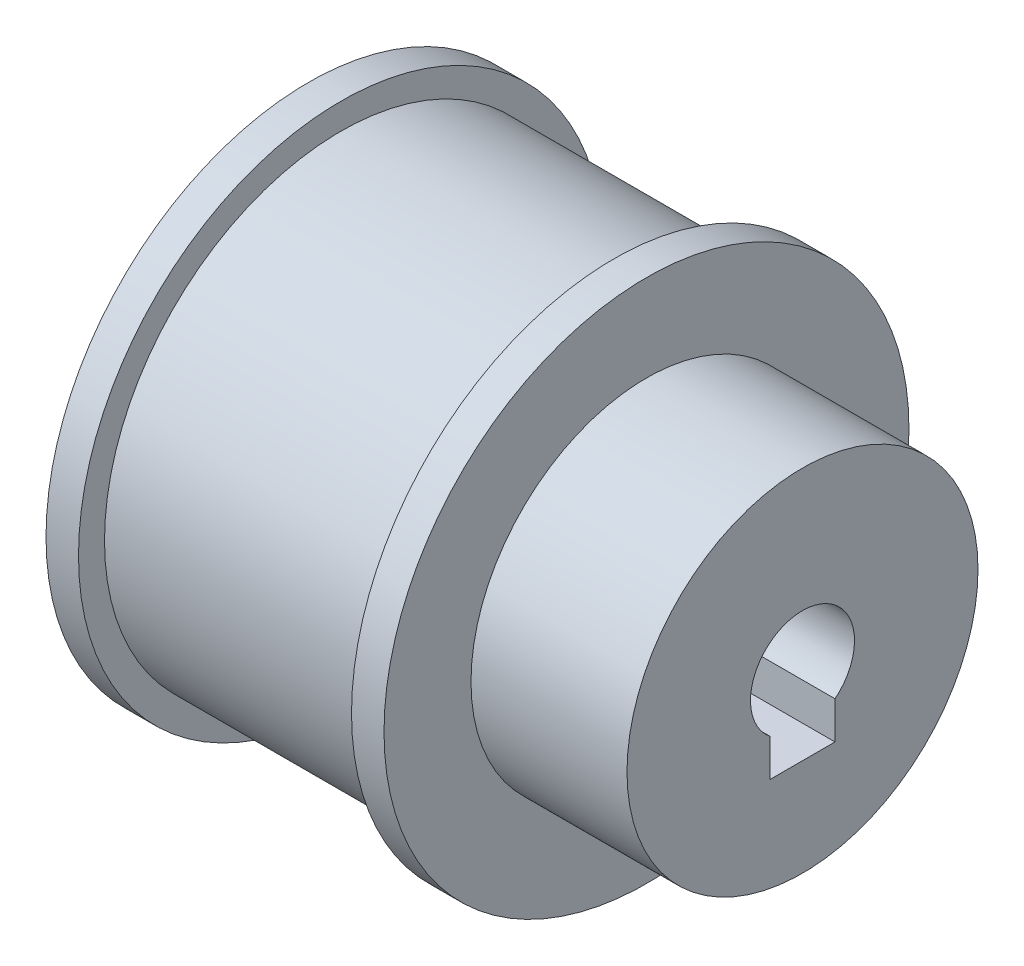
ISO-10303-21;
HEADER;
FILE_DESCRIPTION(('STEP AP214'),'2;1');
FILE_NAME('part.step','',(''),(''),'','','');
FILE_SCHEMA(('AUTOMOTIVE_DESIGN { 1 0 10303 214 1 1 1 1 }'));
ENDSEC;
DATA;
#1=APPLICATION_CONTEXT('core data for automotive mechanical design processes');
#2=APPLICATION_PROTOCOL_DEFINITION('international standard','automotive_design',2000,#1);
#3=PRODUCT_CONTEXT('',#1,'mechanical');
#4=PRODUCT('Part','Part','',(#3));
#5=PRODUCT_RELATED_PRODUCT_CATEGORY('part','',(#4));
#6=PRODUCT_DEFINITION_FORMATION('','',#4);
#7=PRODUCT_DEFINITION_CONTEXT('part definition',#1,'design');
#8=PRODUCT_DEFINITION('design','',#6,#7);
#9=PRODUCT_DEFINITION_SHAPE('','',#8);
#10=(LENGTH_UNIT() NAMED_UNIT(*) SI_UNIT(.MILLI.,.METRE.));
#11=(NAMED_UNIT(*) PLANE_ANGLE_UNIT() SI_UNIT($,.RADIAN.));
#12=(NAMED_UNIT(*) SI_UNIT($,.STERADIAN.) SOLID_ANGLE_UNIT());
#13=UNCERTAINTY_MEASURE_WITH_UNIT(LENGTH_MEASURE(1.E-05),#10,'distance_accuracy_value','');
#14=(GEOMETRIC_REPRESENTATION_CONTEXT(3) GLOBAL_UNCERTAINTY_ASSIGNED_CONTEXT((#13)) GLOBAL_UNIT_ASSIGNED_CONTEXT((#10,
#11,#12)) REPRESENTATION_CONTEXT('',''));
#15=CARTESIAN_POINT('',(0.,0.,0.));
#16=DIRECTION('',(0.,0.,1.));
#17=DIRECTION('',(1.,0.,0.));
#18=AXIS2_PLACEMENT_3D('',#15,#16,#17);
#19=CARTESIAN_POINT('',(0.,0.,0.));
#20=DIRECTION('',(1.,0.,0.));
#21=DIRECTION('',(0.,0.,-1.));
#22=AXIS2_PLACEMENT_3D('',#19,#20,#21);
#23=PLANE('',#22);
#24=DIRECTION('',(0.,1.,0.));
#25=VECTOR('',#24,1.);
#26=CARTESIAN_POINT('',(0.,-3.1224989991992,-2.5));
#27=LINE('',#26,#25);
#28=CARTESIAN_POINT('',(0.,-6.,-2.5));
#29=VERTEX_POINT('',#28);
#30=CARTESIAN_POINT('',(0.,-3.1224989991992,-2.5));
#31=VERTEX_POINT('',#30);
#32=EDGE_CURVE('E82',#29,#31,#27,.T.);
#33=ORIENTED_EDGE('',*,*,#32,.T.);
#34=CARTESIAN_POINT('',(0.,0.,0.));
#35=DIRECTION('',(1.,0.,0.));
#36=DIRECTION('',(0.,0.,-1.));
#37=AXIS2_PLACEMENT_3D('',#34,#35,#36);
#38=CIRCLE('',#37,4.);
#39=CARTESIAN_POINT('',(0.,-3.1224989991992,2.5));
#40=VERTEX_POINT('',#39);
#41=EDGE_CURVE('E76',#31,#40,#38,.T.);
#42=ORIENTED_EDGE('',*,*,#41,.T.);
#43=DIRECTION('',(0.,-1.,0.));
#44=VECTOR('',#43,1.);
#45=CARTESIAN_POINT('',(0.,-3.1224989991992,2.5));
#46=LINE('',#45,#44);
#47=CARTESIAN_POINT('',(0.,-6.,2.5));
#48=VERTEX_POINT('',#47);
#49=EDGE_CURVE('E85',#40,#48,#46,.T.);
#50=ORIENTED_EDGE('',*,*,#49,.T.);
#51=DIRECTION('',(0.,0.,-1.));
#52=VECTOR('',#51,1.);
#53=CARTESIAN_POINT('',(0.,-6.,2.5));
#54=LINE('',#53,#52);
#55=EDGE_CURVE('E48',#48,#29,#54,.T.);
#56=ORIENTED_EDGE('',*,*,#55,.T.);
#57=EDGE_LOOP('',(#33,#42,#50,#56));
#58=FACE_BOUND('',#57,.T.);
#59=CARTESIAN_POINT('',(0.,0.,0.));
#60=DIRECTION('',(-1.,0.,0.));
#61=DIRECTION('',(0.,0.,1.));
#62=AXIS2_PLACEMENT_3D('',#59,#60,#61);
#63=CIRCLE('',#62,20.19);
#64=CARTESIAN_POINT('',(0.,0.,20.19));
#65=VERTEX_POINT('',#64);
#66=EDGE_CURVE('E11',#65,#65,#63,.T.);
#67=ORIENTED_EDGE('',*,*,#66,.T.);
#68=EDGE_LOOP('',(#67));
#69=FACE_BOUND('',#68,.T.);
#70=ADVANCED_FACE('F34',(#58,#69),#23,.F.);
#71=CARTESIAN_POINT('',(0.,0.,0.));
#72=DIRECTION('',(-1.,0.,0.));
#73=DIRECTION('',(0.,0.,1.));
#74=AXIS2_PLACEMENT_3D('',#71,#72,#73);
#75=CYLINDRICAL_SURFACE('',#74,20.19);
#76=ORIENTED_EDGE('',*,*,#66,.F.);
#77=EDGE_LOOP('',(#76));
#78=FACE_BOUND('',#77,.T.);
#79=CARTESIAN_POINT('',(2.5,0.,0.));
#80=DIRECTION('',(-1.,0.,0.));
#81=DIRECTION('',(0.,0.,1.));
#82=AXIS2_PLACEMENT_3D('',#79,#80,#81);
#83=CIRCLE('',#82,20.19);
#84=CARTESIAN_POINT('',(2.5,0.,20.19));
#85=VERTEX_POINT('',#84);
#86=EDGE_CURVE('E41',#85,#85,#83,.T.);
#87=ORIENTED_EDGE('',*,*,#86,.T.);
#88=EDGE_LOOP('',(#87));
#89=FACE_BOUND('',#88,.T.);
#90=ADVANCED_FACE('F129',(#78,#89),#75,.T.);
#91=CARTESIAN_POINT('',(2.5,20.19,0.));
#92=DIRECTION('',(-1.,0.,0.));
#93=DIRECTION('',(0.,0.,1.));
#94=AXIS2_PLACEMENT_3D('',#91,#92,#93);
#95=PLANE('',#94);
#96=ORIENTED_EDGE('',*,*,#86,.F.);
#97=EDGE_LOOP('',(#96));
#98=FACE_BOUND('',#97,.T.);
#99=CARTESIAN_POINT('',(2.5,0.,0.));
#100=DIRECTION('',(-1.,0.,0.));
#101=DIRECTION('',(0.,0.,1.));
#102=AXIS2_PLACEMENT_3D('',#99,#100,#101);
#103=CIRCLE('',#102,18.19);
#104=CARTESIAN_POINT('',(2.5,0.,18.19));
#105=VERTEX_POINT('',#104);
#106=EDGE_CURVE('E124',#105,#105,#103,.T.);
#107=ORIENTED_EDGE('',*,*,#106,.T.);
#108=EDGE_LOOP('',(#107));
#109=FACE_BOUND('',#108,.T.);
#110=ADVANCED_FACE('F131',(#98,#109),#95,.F.);
#111=CARTESIAN_POINT('',(0.,0.,0.));
#112=DIRECTION('',(-1.,0.,0.));
#113=DIRECTION('',(0.,0.,1.));
#114=AXIS2_PLACEMENT_3D('',#111,#112,#113);
#115=CYLINDRICAL_SURFACE('',#114,18.19);
#116=ORIENTED_EDGE('',*,*,#106,.F.);
#117=EDGE_LOOP('',(#116));
#118=FACE_BOUND('',#117,.T.);
#119=CARTESIAN_POINT('',(23.5,0.,0.));
#120=DIRECTION('',(-1.,0.,0.));
#121=DIRECTION('',(0.,0.,1.));
#122=AXIS2_PLACEMENT_3D('',#119,#120,#121);
#123=CIRCLE('',#122,18.19);
#124=CARTESIAN_POINT('',(23.5,0.,18.19));
#125=VERTEX_POINT('',#124);
#126=EDGE_CURVE('E121',#125,#125,#123,.T.);
#127=ORIENTED_EDGE('',*,*,#126,.T.);
#128=EDGE_LOOP('',(#127));
#129=FACE_BOUND('',#128,.T.);
#130=ADVANCED_FACE('F134',(#118,#129),#115,.T.);
#131=CARTESIAN_POINT('',(23.5,18.19,0.));
#132=DIRECTION('',(1.,0.,0.));
#133=DIRECTION('',(0.,0.,-1.));
#134=AXIS2_PLACEMENT_3D('',#131,#132,#133);
#135=PLANE('',#134);
#136=ORIENTED_EDGE('',*,*,#126,.F.);
#137=EDGE_LOOP('',(#136));
#138=FACE_BOUND('',#137,.T.);
#139=CARTESIAN_POINT('',(23.5,0.,0.));
#140=DIRECTION('',(-1.,0.,0.));
#141=DIRECTION('',(0.,0.,1.));
#142=AXIS2_PLACEMENT_3D('',#139,#140,#141);
#143=CIRCLE('',#142,20.19);
#144=CARTESIAN_POINT('',(23.5,0.,20.19));
#145=VERTEX_POINT('',#144);
#146=EDGE_CURVE('E118',#145,#145,#143,.T.);
#147=ORIENTED_EDGE('',*,*,#146,.T.);
#148=EDGE_LOOP('',(#147));
#149=FACE_BOUND('',#148,.T.);
#150=ADVANCED_FACE('F140',(#138,#149),#135,.F.);
#151=CARTESIAN_POINT('',(0.,0.,0.));
#152=DIRECTION('',(-1.,0.,0.));
#153=DIRECTION('',(0.,0.,1.));
#154=AXIS2_PLACEMENT_3D('',#151,#152,#153);
#155=CYLINDRICAL_SURFACE('',#154,20.19);
#156=ORIENTED_EDGE('',*,*,#146,.F.);
#157=EDGE_LOOP('',(#156));
#158=FACE_BOUND('',#157,.T.);
#159=CARTESIAN_POINT('',(26.,0.,0.));
#160=DIRECTION('',(-1.,0.,0.));
#161=DIRECTION('',(0.,0.,1.));
#162=AXIS2_PLACEMENT_3D('',#159,#160,#161);
#163=CIRCLE('',#162,20.19);
#164=CARTESIAN_POINT('',(26.,0.,20.19));
#165=VERTEX_POINT('',#164);
#166=EDGE_CURVE('E115',#165,#165,#163,.T.);
#167=ORIENTED_EDGE('',*,*,#166,.T.);
#168=EDGE_LOOP('',(#167));
#169=FACE_BOUND('',#168,.T.);
#170=ADVANCED_FACE('F146',(#158,#169),#155,.T.);
#171=CARTESIAN_POINT('',(26.,20.19,0.));
#172=DIRECTION('',(-1.,0.,0.));
#173=DIRECTION('',(0.,0.,1.));
#174=AXIS2_PLACEMENT_3D('',#171,#172,#173);
#175=PLANE('',#174);
#176=ORIENTED_EDGE('',*,*,#166,.F.);
#177=EDGE_LOOP('',(#176));
#178=FACE_BOUND('',#177,.T.);
#179=CARTESIAN_POINT('',(26.,0.,0.));
#180=DIRECTION('',(-1.,0.,0.));
#181=DIRECTION('',(0.,0.,1.));
#182=AXIS2_PLACEMENT_3D('',#179,#180,#181);
#183=CIRCLE('',#182,13.5);
#184=CARTESIAN_POINT('',(26.,0.,13.5));
#185=VERTEX_POINT('',#184);
#186=EDGE_CURVE('E112',#185,#185,#183,.T.);
#187=ORIENTED_EDGE('',*,*,#186,.T.);
#188=EDGE_LOOP('',(#187));
#189=FACE_BOUND('',#188,.T.);
#190=ADVANCED_FACE('F152',(#178,#189),#175,.F.);
#191=CARTESIAN_POINT('',(0.,0.,0.));
#192=DIRECTION('',(-1.,0.,0.));
#193=DIRECTION('',(0.,0.,1.));
#194=AXIS2_PLACEMENT_3D('',#191,#192,#193);
#195=CYLINDRICAL_SURFACE('',#194,13.5);
#196=ORIENTED_EDGE('',*,*,#186,.F.);
#197=EDGE_LOOP('',(#196));
#198=FACE_BOUND('',#197,.T.);
#199=CARTESIAN_POINT('',(38.,0.,0.));
#200=DIRECTION('',(-1.,0.,0.));
#201=DIRECTION('',(0.,0.,1.));
#202=AXIS2_PLACEMENT_3D('',#199,#200,#201);
#203=CIRCLE('',#202,13.5);
#204=CARTESIAN_POINT('',(38.,0.,13.5));
#205=VERTEX_POINT('',#204);
#206=EDGE_CURVE('E106',#205,#205,#203,.T.);
#207=ORIENTED_EDGE('',*,*,#206,.T.);
#208=EDGE_LOOP('',(#207));
#209=FACE_BOUND('',#208,.T.);
#210=ADVANCED_FACE('F158',(#198,#209),#195,.T.);
#211=CARTESIAN_POINT('',(38.,13.5,0.));
#212=DIRECTION('',(-1.,0.,0.));
#213=DIRECTION('',(0.,0.,1.));
#214=AXIS2_PLACEMENT_3D('',#211,#212,#213);
#215=PLANE('',#214);
#216=DIRECTION('',(0.,-1.,0.));
#217=VECTOR('',#216,1.);
#218=CARTESIAN_POINT('',(38.,-3.1224989991992,2.5));
#219=LINE('',#218,#217);
#220=CARTESIAN_POINT('',(38.,-3.1224989991992,2.5));
#221=VERTEX_POINT('',#220);
#222=CARTESIAN_POINT('',(38.,-6.,2.5));
#223=VERTEX_POINT('',#222);
#224=EDGE_CURVE('E100',#221,#223,#219,.T.);
#225=ORIENTED_EDGE('',*,*,#224,.F.);
#226=CARTESIAN_POINT('',(38.,0.,0.));
#227=DIRECTION('',(1.,0.,0.));
#228=DIRECTION('',(0.,0.,-1.));
#229=AXIS2_PLACEMENT_3D('',#226,#227,#228);
#230=CIRCLE('',#229,4.);
#231=CARTESIAN_POINT('',(38.,-3.1224989991992,-2.5));
#232=VERTEX_POINT('',#231);
#233=EDGE_CURVE('E56',#232,#221,#230,.T.);
#234=ORIENTED_EDGE('',*,*,#233,.F.);
#235=DIRECTION('',(0.,1.,0.));
#236=VECTOR('',#235,1.);
#237=CARTESIAN_POINT('',(38.,-3.1224989991992,-2.5));
#238=LINE('',#237,#236);
#239=CARTESIAN_POINT('',(38.,-6.,-2.5));
#240=VERTEX_POINT('',#239);
#241=EDGE_CURVE('E91',#240,#232,#238,.T.);
#242=ORIENTED_EDGE('',*,*,#241,.F.);
#243=DIRECTION('',(0.,0.,-1.));
#244=VECTOR('',#243,1.);
#245=CARTESIAN_POINT('',(38.,-6.,2.5));
#246=LINE('',#245,#244);
#247=EDGE_CURVE('E94',#223,#240,#246,.T.);
#248=ORIENTED_EDGE('',*,*,#247,.F.);
#249=EDGE_LOOP('',(#225,#234,#242,#248));
#250=FACE_BOUND('',#249,.T.);
#251=ORIENTED_EDGE('',*,*,#206,.F.);
#252=EDGE_LOOP('',(#251));
#253=FACE_BOUND('',#252,.T.);
#254=ADVANCED_FACE('F164',(#250,#253),#215,.F.);
#255=CARTESIAN_POINT('',(0.,0.,0.));
#256=DIRECTION('',(1.,0.,0.));
#257=DIRECTION('',(0.,0.,-1.));
#258=AXIS2_PLACEMENT_3D('',#255,#256,#257);
#259=CYLINDRICAL_SURFACE('',#258,4.);
#260=ORIENTED_EDGE('',*,*,#233,.T.);
#261=DIRECTION('',(1.,0.,0.));
#262=VECTOR('',#261,1.);
#263=CARTESIAN_POINT('',(0.,-3.1224989991992,2.5));
#264=LINE('',#263,#262);
#265=EDGE_CURVE('E72',#40,#221,#264,.T.);
#266=ORIENTED_EDGE('',*,*,#265,.F.);
#267=ORIENTED_EDGE('',*,*,#41,.F.);
#268=DIRECTION('',(1.,0.,0.));
#269=VECTOR('',#268,1.);
#270=CARTESIAN_POINT('',(0.,-3.1224989991992,-2.5));
#271=LINE('',#270,#269);
#272=EDGE_CURVE('E104',#31,#232,#271,.T.);
#273=ORIENTED_EDGE('',*,*,#272,.T.);
#274=EDGE_LOOP('',(#260,#266,#267,#273));
#275=FACE_BOUND('',#274,.T.);
#276=ADVANCED_FACE('F74',(#275),#259,.F.);
#277=CARTESIAN_POINT('',(0.,-3.1224989991992,-2.5));
#278=DIRECTION('',(0.,0.,-1.));
#279=DIRECTION('',(0.,1.,0.));
#280=AXIS2_PLACEMENT_3D('',#277,#278,#279);
#281=PLANE('',#280);
#282=ORIENTED_EDGE('',*,*,#241,.T.);
#283=ORIENTED_EDGE('',*,*,#272,.F.);
#284=ORIENTED_EDGE('',*,*,#32,.F.);
#285=DIRECTION('',(1.,0.,0.));
#286=VECTOR('',#285,1.);
#287=CARTESIAN_POINT('',(0.,-6.,-2.5));
#288=LINE('',#287,#286);
#289=EDGE_CURVE('E107',#29,#240,#288,.T.);
#290=ORIENTED_EDGE('',*,*,#289,.T.);
#291=EDGE_LOOP('',(#282,#283,#284,#290));
#292=FACE_BOUND('',#291,.T.);
#293=ADVANCED_FACE('F174',(#292),#281,.F.);
#294=CARTESIAN_POINT('',(0.,-6.,2.5));
#295=DIRECTION('',(0.,-1.,0.));
#296=DIRECTION('',(0.,0.,-1.));
#297=AXIS2_PLACEMENT_3D('',#294,#295,#296);
#298=PLANE('',#297);
#299=ORIENTED_EDGE('',*,*,#247,.T.);
#300=ORIENTED_EDGE('',*,*,#289,.F.);
#301=ORIENTED_EDGE('',*,*,#55,.F.);
#302=DIRECTION('',(1.,0.,0.));
#303=VECTOR('',#302,1.);
#304=CARTESIAN_POINT('',(0.,-6.,2.5));
#305=LINE('',#304,#303);
#306=EDGE_CURVE('E81',#48,#223,#305,.T.);
#307=ORIENTED_EDGE('',*,*,#306,.T.);
#308=EDGE_LOOP('',(#299,#300,#301,#307));
#309=FACE_BOUND('',#308,.T.);
#310=ADVANCED_FACE('F228',(#309),#298,.F.);
#311=CARTESIAN_POINT('',(0.,-3.1224989991992,2.5));
#312=DIRECTION('',(0.,0.,1.));
#313=DIRECTION('',(0.,-1.,0.));
#314=AXIS2_PLACEMENT_3D('',#311,#312,#313);
#315=PLANE('',#314);
#316=ORIENTED_EDGE('',*,*,#224,.T.);
#317=ORIENTED_EDGE('',*,*,#306,.F.);
#318=ORIENTED_EDGE('',*,*,#49,.F.);
#319=ORIENTED_EDGE('',*,*,#265,.T.);
#320=EDGE_LOOP('',(#316,#317,#318,#319));
#321=FACE_BOUND('',#320,.T.);
#322=ADVANCED_FACE('F86',(#321),#315,.F.);
#323=CLOSED_SHELL('',(#70,#90,#110,#130,#150,#170,#190,#210,#254,#276,#293,#310,#322));
#324=MANIFOLD_SOLID_BREP('B2',#323);
#325=ADVANCED_BREP_SHAPE_REPRESENTATION('',(#18,#324),#14);
#326=SHAPE_DEFINITION_REPRESENTATION(#9,#325);
ENDSEC;
END-ISO-10303-21;
